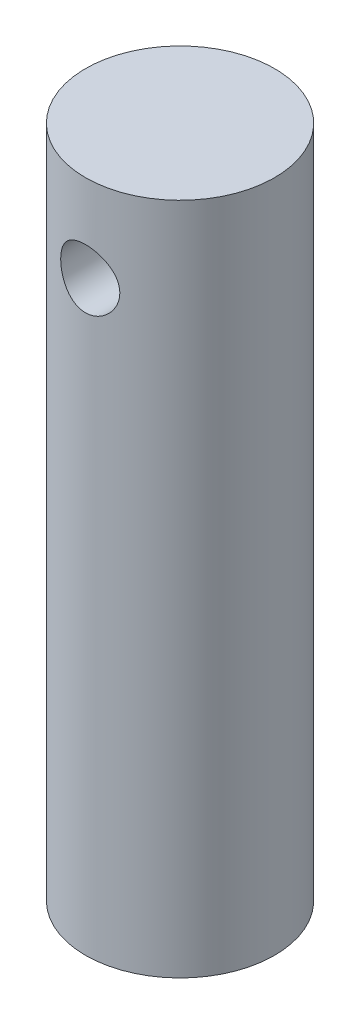
ISO-10303-21;
HEADER;
FILE_DESCRIPTION(('STEP AP214'),'2;1');
FILE_NAME('part.step','',(''),(''),'','','');
FILE_SCHEMA(('AUTOMOTIVE_DESIGN { 1 0 10303 214 1 1 1 1 }'));
ENDSEC;
DATA;
#1=APPLICATION_CONTEXT('core data for automotive mechanical design processes');
#2=APPLICATION_PROTOCOL_DEFINITION('international standard','automotive_design',2000,#1);
#3=PRODUCT_CONTEXT('',#1,'mechanical');
#4=PRODUCT('Part','Part','',(#3));
#5=PRODUCT_RELATED_PRODUCT_CATEGORY('part','',(#4));
#6=PRODUCT_DEFINITION_FORMATION('','',#4);
#7=PRODUCT_DEFINITION_CONTEXT('part definition',#1,'design');
#8=PRODUCT_DEFINITION('design','',#6,#7);
#9=PRODUCT_DEFINITION_SHAPE('','',#8);
#10=(LENGTH_UNIT() NAMED_UNIT(*) SI_UNIT(.MILLI.,.METRE.));
#11=(NAMED_UNIT(*) PLANE_ANGLE_UNIT() SI_UNIT($,.RADIAN.));
#12=(NAMED_UNIT(*) SI_UNIT($,.STERADIAN.) SOLID_ANGLE_UNIT());
#13=UNCERTAINTY_MEASURE_WITH_UNIT(LENGTH_MEASURE(1.E-05),#10,'distance_accuracy_value','');
#14=(GEOMETRIC_REPRESENTATION_CONTEXT(3) GLOBAL_UNCERTAINTY_ASSIGNED_CONTEXT((#13)) GLOBAL_UNIT_ASSIGNED_CONTEXT((#10,
#11,#12)) REPRESENTATION_CONTEXT('',''));
#15=CARTESIAN_POINT('',(0.,0.,0.));
#16=DIRECTION('',(0.,0.,1.));
#17=DIRECTION('',(1.,0.,0.));
#18=AXIS2_PLACEMENT_3D('',#15,#16,#17);
#19=CARTESIAN_POINT('',(0.,72.39,0.));
#20=DIRECTION('',(0.,-1.,0.));
#21=DIRECTION('',(0.,0.,-1.));
#22=AXIS2_PLACEMENT_3D('',#19,#20,#21);
#23=CYLINDRICAL_SURFACE('',#22,10.16);
#24=CARTESIAN_POINT('',(0.,66.167,-10.16));
#25=CARTESIAN_POINT('',(-0.173835530343348,66.1669988656675,-10.1599991333009));
#26=CARTESIAN_POINT('',(-0.347682953357263,66.1526763635611,-10.155496452615));
#27=CARTESIAN_POINT('',(-0.69029379235466,66.0959149464903,-10.1379755098557));
#28=CARTESIAN_POINT('',(-0.859056048523806,66.0534696673345,-10.1249553202764));
#29=CARTESIAN_POINT('',(-1.18650650087305,65.9420337971628,-10.0918217187269));
#30=CARTESIAN_POINT('',(-1.34520984954395,65.8730842945815,-10.0717192900752));
#31=CARTESIAN_POINT('',(-1.64880239796001,65.710772013097,-10.0264968166918));
#32=CARTESIAN_POINT('',(-1.79368941603001,65.6174053872773,-10.0013759814576));
#33=CARTESIAN_POINT('',(-2.0700119507788,65.4058737802759,-9.94791542900317));
#34=CARTESIAN_POINT('',(-2.20096087151792,65.2870909519449,-9.91950558454552));
#35=CARTESIAN_POINT('',(-2.44144135037397,65.0294142832696,-9.86307517790489));
#36=CARTESIAN_POINT('',(-2.55096892116269,64.8905167071638,-9.83505468909581));
#37=CARTESIAN_POINT('',(-2.74813614667108,64.5923408079275,-9.78182307533358));
#38=CARTESIAN_POINT('',(-2.83516791741327,64.4326436070808,-9.75669850286561));
#39=CARTESIAN_POINT('',(-2.98093742334746,64.099967519946,-9.71315816570055));
#40=CARTESIAN_POINT('',(-3.03968261180739,63.9269921462834,-9.69474063406869));
#41=CARTESIAN_POINT('',(-3.12543088222285,63.5781606832718,-9.66743321740632));
#42=CARTESIAN_POINT('',(-3.15333659419976,63.4025482171573,-9.65827311240951));
#43=CARTESIAN_POINT('',(-3.1794336979395,63.0489134779638,-9.64971540058014));
#44=CARTESIAN_POINT('',(-3.17763298929261,62.870891858113,-9.65031519837429));
#45=CARTESIAN_POINT('',(-3.14507434821158,62.5249588709168,-9.66097100251613));
#46=CARTESIAN_POINT('',(-3.11546386988232,62.3569260203116,-9.6706522803471));
#47=CARTESIAN_POINT('',(-3.0299866592329,62.0283439223951,-9.69777145157322));
#48=CARTESIAN_POINT('',(-2.97411713645158,61.8677954724196,-9.71521016931512));
#49=CARTESIAN_POINT('',(-2.83689741690444,61.5560060611411,-9.75616651796313));
#50=CARTESIAN_POINT('',(-2.75518691181688,61.4049353288424,-9.77976923038494));
#51=CARTESIAN_POINT('',(-2.56885492674135,61.118273069587,-9.83035515713377));
#52=CARTESIAN_POINT('',(-2.46422749524807,60.9826855775556,-9.85733924882159));
#53=CARTESIAN_POINT('',(-2.2294010636226,60.7243516437208,-9.91315080613252));
#54=CARTESIAN_POINT('',(-2.09825480930576,60.6024707232396,-9.94200626798467));
#55=CARTESIAN_POINT('',(-1.81702559656265,60.3822213903076,-9.99722589729334));
#56=CARTESIAN_POINT('',(-1.66694123646651,60.2838547197832,-10.0235898800947));
#57=CARTESIAN_POINT('',(-1.35042811058225,60.1128396709528,-10.0711328902109));
#58=CARTESIAN_POINT('',(-1.18388106357497,60.0403977359215,-10.0922699004645));
#59=CARTESIAN_POINT('',(-0.840150663567915,59.924815377837,-10.1266740780453));
#60=CARTESIAN_POINT('',(-0.662970558040503,59.8816660575145,-10.1399436348589));
#61=CARTESIAN_POINT('',(-0.310350299517474,59.8273681718494,-10.1567332906333));
#62=CARTESIAN_POINT('',(-0.13510729592366,59.8150478992724,-10.1606101815441));
#63=CARTESIAN_POINT('',(0.214960976560769,59.8194542156588,-10.159232913167));
#64=CARTESIAN_POINT('',(0.389786302738533,59.8361765613994,-10.1539800877608));
#65=CARTESIAN_POINT('',(0.729537105758656,59.8972528052202,-10.1351680397519));
#66=CARTESIAN_POINT('',(0.894600645189178,59.9409094997357,-10.1218185450115));
#67=CARTESIAN_POINT('',(1.2150138993079,60.0537644550115,-10.088375083034));
#68=CARTESIAN_POINT('',(1.37036241154061,60.1229658702235,-10.0682802828643));
#69=CARTESIAN_POINT('',(1.67114831294736,60.2868319700337,-10.0228029860894));
#70=CARTESIAN_POINT('',(1.81625173906099,60.3820763082419,-9.99730352116876));
#71=CARTESIAN_POINT('',(2.08880926143906,60.5946291536982,-9.94393261408711));
#72=CARTESIAN_POINT('',(2.21625855463163,60.7119436450714,-9.91606052973634));
#73=CARTESIAN_POINT('',(2.45513215581431,60.9708175807323,-9.85969567003179));
#74=CARTESIAN_POINT('',(2.56572136942409,61.1131535258976,-9.83122206234361));
#75=CARTESIAN_POINT('',(2.76151975622684,61.414981605597,-9.77803345622839));
#76=CARTESIAN_POINT('',(2.84672933252511,61.5744734675885,-9.75331839810728));
#77=CARTESIAN_POINT('',(2.98882012040577,61.905756739091,-9.71071927120408));
#78=CARTESIAN_POINT('',(3.04581101672272,62.0774975095667,-9.69280881746461));
#79=CARTESIAN_POINT('',(3.12986151567949,62.4288121328515,-9.66599973944548));
#80=CARTESIAN_POINT('',(3.15693250791546,62.6083829779126,-9.65709768605119));
#81=CARTESIAN_POINT('',(3.17955691641639,62.9615303824543,-9.64967063493247));
#82=CARTESIAN_POINT('',(3.17648030238955,63.1350107727724,-9.6506945568436));
#83=CARTESIAN_POINT('',(3.14220398047238,63.4788534457525,-9.66190829554795));
#84=CARTESIAN_POINT('',(3.1110055844918,63.6492158734923,-9.67209768476274));
#85=CARTESIAN_POINT('',(3.02228833980588,63.9795368605634,-9.7001790802581));
#86=CARTESIAN_POINT('',(2.96516151711261,64.1396112203771,-9.71795613403252));
#87=CARTESIAN_POINT('',(2.82651777430899,64.4480306503764,-9.75918048806593));
#88=CARTESIAN_POINT('',(2.74499589288361,64.5963733268791,-9.78262894155266));
#89=CARTESIAN_POINT('',(2.55614614534273,64.8834007649171,-9.83369857065097));
#90=CARTESIAN_POINT('',(2.44793347151296,65.0214806489306,-9.8614471026431));
#91=CARTESIAN_POINT('',(2.21033085086819,65.2779652734045,-9.91740457005873));
#92=CARTESIAN_POINT('',(2.08093523955475,65.3963647340373,-9.94561362680902));
#93=CARTESIAN_POINT('',(1.7995561235713,65.6139976474418,-10.0004187075928));
#94=CARTESIAN_POINT('',(1.64697301919795,65.7124790305829,-10.0269319839591));
#95=CARTESIAN_POINT('',(1.32658901055466,65.8822632444542,-10.0743199401407));
#96=CARTESIAN_POINT('',(1.15879412080043,65.9535767594403,-10.0951968356219));
#97=CARTESIAN_POINT('',(0.8273989938499,66.0618220737255,-10.1275045286301));
#98=CARTESIAN_POINT('',(0.664642656265861,66.1011501629555,-10.139584516476));
#99=CARTESIAN_POINT('',(0.334593934418225,66.153737034318,-10.1558318686483));
#100=CARTESIAN_POINT('',(0.167302474994772,66.1670010917022,-10.1600008341269));
#101=CARTESIAN_POINT('',(0.,66.167,-10.16));
#102=B_SPLINE_CURVE_WITH_KNOTS('',3,(#24,#25,#26,#27,#28,#29,#30,#31,#32,#33,#34,#35,#36,#37,
#38,#39,#40,#41,#42,#43,#44,#45,#46,#47,#48,#49,#50,#51,#52,#53,#54,#55,#56,#57,#58,#59,#60,#61,
#62,#63,#64,#65,#66,#67,#68,#69,#70,#71,#72,#73,#74,#75,#76,#77,#78,#79,#80,#81,#82,#83,#84,#85,
#86,#87,#88,#89,#90,#91,#92,#93,#94,#95,#96,#97,#98,#99,#100,#101),.UNSPECIFIED.,.T.,.F.,(4,2,2,
2,2,2,2,2,2,2,2,2,2,2,2,2,2,2,2,2,2,2,2,2,2,2,2,2,2,2,2,2,2,2,2,2,2,2,4),(0.,0.520891641558577,
1.04190120130663,1.56210629717419,2.08239340075832,2.61716068375703,3.15202741275442,
3.70011378968635,4.24805567149999,4.77949641424713,5.31079583749651,5.82109370252309,
6.33144580746819,6.84925332510184,7.3671954766631,7.90871538090183,8.4502753882979,
8.99605670152016,9.54167216616167,10.0662122411252,10.5906756854938,11.1021019187609,
11.6135913278763,12.1375506483539,12.6616522410152,13.2065211793137,13.7513814629863,
14.2941069401352,14.8366257469924,15.3546099684765,15.8725700267201,16.382947000518,
16.8934278422289,17.4238796560041,17.9544735495254,18.5023929706534,19.0500966895675,
19.5515137711917,20.0528293576239),.UNSPECIFIED.);
#103=CARTESIAN_POINT('',(0.,66.167,-10.16));
#104=VERTEX_POINT('',#103);
#105=EDGE_CURVE('E10',#104,#104,#102,.T.);
#106=ORIENTED_EDGE('',*,*,#105,.T.);
#107=EDGE_LOOP('',(#106));
#108=FACE_BOUND('',#107,.T.);
#109=CARTESIAN_POINT('',(3.175,62.992,9.65116443751737));
#110=CARTESIAN_POINT('',(3.1749988260132,62.8183985282823,9.65116550743318));
#111=CARTESIAN_POINT('',(3.16071348530396,62.6447851274939,9.65589970022809));
#112=CARTESIAN_POINT('',(3.1041130551937,62.3026588313704,9.67424123057147));
#113=CARTESIAN_POINT('',(3.06179039107588,62.1341473272603,9.68785096596966));
#114=CARTESIAN_POINT('',(2.9507126208784,61.8072299490927,9.72225484643338));
#115=CARTESIAN_POINT('',(2.88200428771159,61.6488067679116,9.74303627193565));
#116=CARTESIAN_POINT('',(2.72026161999818,61.3456921525054,9.78942431795469));
#117=CARTESIAN_POINT('',(2.62722298800305,61.2010031503013,9.81503179067035));
#118=CARTESIAN_POINT('',(2.41603801938062,60.9244936765665,9.86917324278295));
#119=CARTESIAN_POINT('',(2.29719987528981,60.7932144320326,9.89777353397342));
#120=CARTESIAN_POINT('',(2.03926959799696,60.5520861264487,9.95411384485253));
#121=CARTESIAN_POINT('',(1.90017464139716,60.4422400577601,9.98185374396473));
#122=CARTESIAN_POINT('',(1.60178981773314,60.2447078999514,10.034106256108));
#123=CARTESIAN_POINT('',(1.44211435356105,60.1575791922681,10.0585316878946));
#124=CARTESIAN_POINT('',(1.10948275144765,60.0116248333669,10.1006288165587));
#125=CARTESIAN_POINT('',(0.936529746157117,59.9527925296601,10.118302100666));
#126=CARTESIAN_POINT('',(0.587919466693895,59.8669081346334,10.1444342658499));
#127=CARTESIAN_POINT('',(0.412510517289275,59.8389309955389,10.1531607701972));
#128=CARTESIAN_POINT('',(0.059285667520685,59.8126201600487,10.1613613352508));
#129=CARTESIAN_POINT('',(-0.118529676511635,59.8142797251286,10.1608374992158));
#130=CARTESIAN_POINT('',(-0.465009180101015,59.8465866606283,10.1507827497663));
#131=CARTESIAN_POINT('',(-0.63377733115764,59.876231234123,10.1415634346923));
#132=CARTESIAN_POINT('',(-0.96381078090336,59.9620212747093,10.1155368570462));
#133=CARTESIAN_POINT('',(-1.12507558952234,60.01816847012,10.0987290996111));
#134=CARTESIAN_POINT('',(-1.43783838201304,60.15601428025,10.0589958771282));
#135=CARTESIAN_POINT('',(-1.5891926702816,60.2380172137494,10.0359980538634));
#136=CARTESIAN_POINT('',(-1.87630437832654,60.4250025932503,9.98630776302775));
#137=CARTESIAN_POINT('',(-2.0120578407719,60.5299908502127,9.95961436179963));
#138=CARTESIAN_POINT('',(-2.27009375407134,60.7651150323925,9.90406123663171));
#139=CARTESIAN_POINT('',(-2.39157903469345,60.8961166348462,9.87515759241501));
#140=CARTESIAN_POINT('',(-2.61109394619801,61.1769035586446,9.81940163229421));
#141=CARTESIAN_POINT('',(-2.70912081431519,61.3266910892995,9.79254955826273));
#142=CARTESIAN_POINT('',(-2.87986381148474,61.6430503708728,9.74371550447553));
#143=CARTESIAN_POINT('',(-2.952284689774,61.8097910588371,9.72179133347007));
#144=CARTESIAN_POINT('',(-3.06776998701686,62.1539511092787,9.68597365008278));
#145=CARTESIAN_POINT('',(-3.11084495343104,62.3313666100537,9.67207725264479));
#146=CARTESIAN_POINT('',(-3.16487772373468,62.6842026795459,9.65452891053885));
#147=CARTESIAN_POINT('',(-3.17705624058899,62.8594170704372,9.65048784640141));
#148=CARTESIAN_POINT('',(-3.17237731025227,63.2093979433977,9.65202736748209));
#149=CARTESIAN_POINT('',(-3.15552434962973,63.3841644904971,9.65760646598584));
#150=CARTESIAN_POINT('',(-3.09435178723505,63.7230330734971,9.67737352009148));
#151=CARTESIAN_POINT('',(-3.05084051147798,63.8872973561485,9.69130787419109));
#152=CARTESIAN_POINT('',(-2.93853549098977,64.2061753516694,9.72594669821708));
#153=CARTESIAN_POINT('',(-2.86973762274724,64.3607874857397,9.74665227227272));
#154=CARTESIAN_POINT('',(-2.70656077065931,64.6608793388204,9.79323770719215));
#155=CARTESIAN_POINT('',(-2.61150474620938,64.8059699956057,9.81924892863976));
#156=CARTESIAN_POINT('',(-2.3993002780467,65.0785854797592,9.87324286390931));
#157=CARTESIAN_POINT('',(-2.28214609531458,65.2061057290703,9.9012260886867));
#158=CARTESIAN_POINT('',(-2.02329528729416,65.4454123294185,9.95741436409221));
#159=CARTESIAN_POINT('',(-1.88078275046285,65.5563275767953,9.9855805440563));
#160=CARTESIAN_POINT('',(-1.57848692595455,65.752703250036,10.0378021200294));
#161=CARTESIAN_POINT('',(-1.4187044298159,65.83816484185,10.06185770431));
#162=CARTESIAN_POINT('',(-1.08738802926285,65.9803876286781,10.1030103229842));
#163=CARTESIAN_POINT('',(-0.91594986808074,66.0373565911229,10.1201575488545));
#164=CARTESIAN_POINT('',(-0.565295425303232,66.1214642480178,10.1457821632738));
#165=CARTESIAN_POINT('',(-0.386081595984509,66.1486122772721,10.1542622648226));
#166=CARTESIAN_POINT('',(-0.0329817390882069,66.171549144444,10.1614174064733));
#167=CARTESIAN_POINT('',(0.140815547544163,66.1685962634337,10.1604858869477));
#168=CARTESIAN_POINT('',(0.485325983685048,66.1344579999363,10.1498648432586));
#169=CARTESIAN_POINT('',(0.656039333536102,66.1032744581805,10.1401758901085));
#170=CARTESIAN_POINT('',(0.98743800094121,66.0143612165754,10.1132530994578));
#171=CARTESIAN_POINT('',(1.14822203286168,65.9569683960728,10.0961151381892));
#172=CARTESIAN_POINT('',(1.45795600077023,65.8175700988905,10.0560618179339));
#173=CARTESIAN_POINT('',(1.60690390143718,65.7355604006675,10.0331454681205));
#174=CARTESIAN_POINT('',(1.89423470522301,65.5460391938051,9.98295938083775));
#175=CARTESIAN_POINT('',(2.0320879019149,65.4377570529415,9.95556834767444));
#176=CARTESIAN_POINT('',(2.28808481015427,65.2001238808136,9.89987190829534));
#177=CARTESIAN_POINT('',(2.40622260310057,65.070766545686,9.8715662305346));
#178=CARTESIAN_POINT('',(2.62338479414582,64.7895180716036,9.81613207146692));
#179=CARTESIAN_POINT('',(2.72164627106566,64.6370223560839,9.78907366193178));
#180=CARTESIAN_POINT('',(2.89103995701245,64.3168687745164,9.74039518210009));
#181=CARTESIAN_POINT('',(2.96218313845006,64.1492170748164,9.71877291347922));
#182=CARTESIAN_POINT('',(3.07012798306912,63.8182045520207,9.68518663518432));
#183=CARTESIAN_POINT('',(3.10933947188198,63.655695529473,9.67255660211122));
#184=CARTESIAN_POINT('',(3.16177284372893,63.3261272664749,9.65554600465292));
#185=CARTESIAN_POINT('',(3.17500112981177,63.1590691573482,9.6511634078606));
#186=CARTESIAN_POINT('',(3.175,62.992,9.65116443751737));
#187=B_SPLINE_CURVE_WITH_KNOTS('',3,(#109,#110,#111,#112,#113,#114,#115,#116,#117,#118,#119,
#120,#121,#122,#123,#124,#125,#126,#127,#128,#129,#130,#131,#132,#133,#134,#135,#136,#137,#138,
#139,#140,#141,#142,#143,#144,#145,#146,#147,#148,#149,#150,#151,#152,#153,#154,#155,#156,#157,
#158,#159,#160,#161,#162,#163,#164,#165,#166,#167,#168,#169,#170,#171,#172,#173,#174,#175,#176,
#177,#178,#179,#180,#181,#182,#183,#184,#185,#186),.UNSPECIFIED.,.T.,.F.,(4,2,2,2,2,2,2,2,2,2,2,
2,2,2,2,2,2,2,2,2,2,2,2,2,2,2,2,2,2,2,2,2,2,2,2,2,2,2,4),(0.,0.520187269373174,1.04051513273173,
1.55992485606119,2.07942638450937,2.61510984599129,3.15086804270451,3.69874347787882,
4.24649004441521,4.77732656002255,5.30804238038307,5.82043496743166,6.33286097382837,
6.85155867705359,7.37038766491496,7.91083860900828,8.45135317228591,8.99791116176353,
9.5442726044617,10.0686853055753,10.5930169704266,11.1021868899886,11.6114398772933,
12.1352973781259,12.6592911155635,13.2050012204741,13.7506863243158,14.2923320780531,
14.8338082328326,15.3527455820257,15.8716490972464,16.3840629015367,16.8965646298177,
17.4264496049342,17.9564933674754,18.5040980058051,19.0514808404789,19.552217801095,
20.0528313494568),.UNSPECIFIED.);
#188=CARTESIAN_POINT('',(3.175,62.992,9.65116443751737));
#189=VERTEX_POINT('',#188);
#190=EDGE_CURVE('E53',#189,#189,#187,.T.);
#191=ORIENTED_EDGE('',*,*,#190,.T.);
#192=EDGE_LOOP('',(#191));
#193=FACE_BOUND('',#192,.T.);
#194=CARTESIAN_POINT('',(0.,72.39,0.));
#195=DIRECTION('',(0.,1.,0.));
#196=DIRECTION('',(0.,0.,1.));
#197=AXIS2_PLACEMENT_3D('',#194,#195,#196);
#198=CIRCLE('',#197,10.16);
#199=CARTESIAN_POINT('',(0.,72.39,10.16));
#200=VERTEX_POINT('',#199);
#201=EDGE_CURVE('E58',#200,#200,#198,.T.);
#202=ORIENTED_EDGE('',*,*,#201,.F.);
#203=EDGE_LOOP('',(#202));
#204=FACE_BOUND('',#203,.T.);
#205=CARTESIAN_POINT('',(0.,0.,0.));
#206=DIRECTION('',(0.,1.,0.));
#207=DIRECTION('',(0.,0.,1.));
#208=AXIS2_PLACEMENT_3D('',#205,#206,#207);
#209=CIRCLE('',#208,10.16);
#210=CARTESIAN_POINT('',(0.,0.,10.16));
#211=VERTEX_POINT('',#210);
#212=EDGE_CURVE('E63',#211,#211,#209,.T.);
#213=ORIENTED_EDGE('',*,*,#212,.T.);
#214=EDGE_LOOP('',(#213));
#215=FACE_BOUND('',#214,.T.);
#216=ADVANCED_FACE('F41',(#108,#193,#204,#215),#23,.T.);
#217=CARTESIAN_POINT('',(0.,72.39,0.));
#218=DIRECTION('',(0.,1.,0.));
#219=DIRECTION('',(0.,0.,1.));
#220=AXIS2_PLACEMENT_3D('',#217,#218,#219);
#221=PLANE('',#220);
#222=ORIENTED_EDGE('',*,*,#201,.T.);
#223=EDGE_LOOP('',(#222));
#224=FACE_BOUND('',#223,.T.);
#225=ADVANCED_FACE('F75',(#224),#221,.T.);
#226=CARTESIAN_POINT('',(0.,0.,0.));
#227=DIRECTION('',(0.,1.,0.));
#228=DIRECTION('',(0.,0.,1.));
#229=AXIS2_PLACEMENT_3D('',#226,#227,#228);
#230=PLANE('',#229);
#231=ORIENTED_EDGE('',*,*,#212,.F.);
#232=EDGE_LOOP('',(#231));
#233=FACE_BOUND('',#232,.T.);
#234=ADVANCED_FACE('F73',(#233),#230,.F.);
#235=CARTESIAN_POINT('',(0.,62.992,-10.16));
#236=DIRECTION('',(0.,0.,1.));
#237=DIRECTION('',(1.,0.,0.));
#238=AXIS2_PLACEMENT_3D('',#235,#236,#237);
#239=CYLINDRICAL_SURFACE('',#238,3.175);
#240=ORIENTED_EDGE('',*,*,#190,.F.);
#241=EDGE_LOOP('',(#240));
#242=FACE_BOUND('',#241,.T.);
#243=ORIENTED_EDGE('',*,*,#105,.F.);
#244=EDGE_LOOP('',(#243));
#245=FACE_BOUND('',#244,.T.);
#246=ADVANCED_FACE('F69',(#242,#245),#239,.F.);
#247=CLOSED_SHELL('',(#216,#225,#234,#246));
#248=MANIFOLD_SOLID_BREP('B2',#247);
#249=ADVANCED_BREP_SHAPE_REPRESENTATION('',(#18,#248),#14);
#250=SHAPE_DEFINITION_REPRESENTATION(#9,#249);
ENDSEC;
END-ISO-10303-21;
